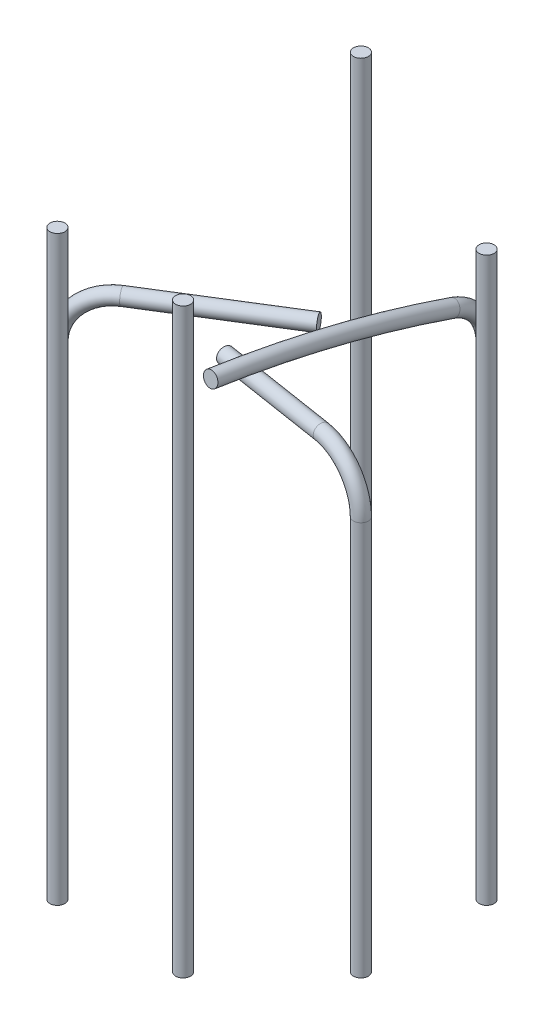
ISO-10303-21;
HEADER;
FILE_DESCRIPTION(('STEP AP214'),'2;1');
FILE_NAME('part.step','',(''),(''),'','','');
FILE_SCHEMA(('AUTOMOTIVE_DESIGN { 1 0 10303 214 1 1 1 1 }'));
ENDSEC;
DATA;
#1=APPLICATION_CONTEXT('core data for automotive mechanical design processes');
#2=APPLICATION_PROTOCOL_DEFINITION('international standard','automotive_design',2000,#1);
#3=PRODUCT_CONTEXT('',#1,'mechanical');
#4=PRODUCT('Part','Part','',(#3));
#5=PRODUCT_RELATED_PRODUCT_CATEGORY('part','',(#4));
#6=PRODUCT_DEFINITION_FORMATION('','',#4);
#7=PRODUCT_DEFINITION_CONTEXT('part definition',#1,'design');
#8=PRODUCT_DEFINITION('design','',#6,#7);
#9=PRODUCT_DEFINITION_SHAPE('','',#8);
#10=(LENGTH_UNIT() NAMED_UNIT(*) SI_UNIT(.MILLI.,.METRE.));
#11=(NAMED_UNIT(*) PLANE_ANGLE_UNIT() SI_UNIT($,.RADIAN.));
#12=(NAMED_UNIT(*) SI_UNIT($,.STERADIAN.) SOLID_ANGLE_UNIT());
#13=UNCERTAINTY_MEASURE_WITH_UNIT(LENGTH_MEASURE(1.E-05),#10,'distance_accuracy_value','');
#14=(GEOMETRIC_REPRESENTATION_CONTEXT(3) GLOBAL_UNCERTAINTY_ASSIGNED_CONTEXT((#13)) GLOBAL_UNIT_ASSIGNED_CONTEXT((#10,
#11,#12)) REPRESENTATION_CONTEXT('',''));
#15=CARTESIAN_POINT('',(0.,0.,0.));
#16=DIRECTION('',(0.,0.,1.));
#17=DIRECTION('',(1.,0.,0.));
#18=AXIS2_PLACEMENT_3D('',#15,#16,#17);
#19=CARTESIAN_POINT('',(2.41815802345188,-56.0965582466183,13.2239312862109));
#20=DIRECTION('',(0.999048221581857,0.,0.0436193873653495));
#21=DIRECTION('',(0.0436193873653495,0.,-0.999048221581857));
#22=AXIS2_PLACEMENT_3D('',#19,#20,#21);
#23=TOROIDAL_SURFACE('',#22,65.,0.4);
#24=CARTESIAN_POINT('',(3.27228250643434,5.88386232986473,-6.33873562118831));
#25=DIRECTION('',(-0.0415930457568139,0.301250830306413,0.952637368458937));
#26=DIRECTION('',(0.0304500014394865,-0.952637368458937,0.302580306080827));
#27=AXIS2_PLACEMENT_3D('',#24,#25,#26);
#28=CIRCLE('',#27,0.4);
#29=CARTESIAN_POINT('',(3.27753865709885,6.26528030264308,-6.45912126369538));
#30=VERTEX_POINT('',#29);
#31=EDGE_CURVE('E46',#30,#30,#28,.T.);
#32=CARTESIAN_POINT('',(2.73356167491425,8.49999999999999,6.));
#33=DIRECTION('',(-0.0433486507173479,0.111243283359509,0.992847332870659));
#34=DIRECTION('',(0.0387301258803981,-0.992847332870659,0.112934277174413));
#35=AXIS2_PLACEMENT_3D('',#32,#33,#34);
#36=CIRCLE('',#35,0.4);
#37=CARTESIAN_POINT('',(2.73550262046171,8.89751728151764,5.9555450382387));
#38=VERTEX_POINT('',#37);
#39=EDGE_CURVE('E11',#38,#38,#36,.T.);
#40=CARTESIAN_POINT('',(2.41815802345188,-56.0965582466183,13.2239312862109));
#41=DIRECTION('',(0.999048221581857,0.,0.0436193873653495));
#42=DIRECTION('',(0.0436193873653495,0.,-0.999048221581857));
#43=AXIS2_PLACEMENT_3D('',#40,#41,#42);
#44=CIRCLE('',#43,65.4);
#45=EDGE_CURVE('',#30,#38,#44,.T.);
#46=ORIENTED_EDGE('',*,*,#31,.T.);
#47=ORIENTED_EDGE('',*,*,#39,.F.);
#48=ORIENTED_EDGE('',*,*,#45,.T.);
#49=ORIENTED_EDGE('',*,*,#45,.F.);
#50=EDGE_LOOP('',(#46,#48,#47,#49));
#51=FACE_BOUND('',#50,.T.);
#52=ADVANCED_FACE('F40',(#51),#23,.T.);
#53=CARTESIAN_POINT('',(3.23943156478117,3.5,-5.58632535551912));
#54=DIRECTION('',(0.999048221581857,0.,0.0436193873653497));
#55=DIRECTION('',(0.0436193873653497,0.,-0.999048221581857));
#56=AXIS2_PLACEMENT_3D('',#53,#54,#55);
#57=TOROIDAL_SURFACE('',#56,2.5,0.4);
#58=CARTESIAN_POINT('',(3.34848003319454,3.5,-8.08394590947376));
#59=DIRECTION('',(0.,1.,0.));
#60=DIRECTION('',(0.,0.,1.));
#61=AXIS2_PLACEMENT_3D('',#58,#59,#60);
#62=CIRCLE('',#61,0.4);
#63=CARTESIAN_POINT('',(3.36592778814068,3.5,-8.4835651981065));
#64=VERTEX_POINT('',#63);
#65=EDGE_CURVE('E50',#64,#64,#62,.T.);
#66=CARTESIAN_POINT('',(3.23943156478117,3.5,-5.58632535551912));
#67=DIRECTION('',(0.999048221581857,0.,0.0436193873653497));
#68=DIRECTION('',(0.0436193873653497,0.,-0.999048221581857));
#69=AXIS2_PLACEMENT_3D('',#66,#67,#68);
#70=CIRCLE('',#69,2.9);
#71=EDGE_CURVE('',#64,#30,#70,.T.);
#72=ORIENTED_EDGE('',*,*,#65,.T.);
#73=ORIENTED_EDGE('',*,*,#31,.F.);
#74=ORIENTED_EDGE('',*,*,#71,.T.);
#75=ORIENTED_EDGE('',*,*,#71,.F.);
#76=EDGE_LOOP('',(#72,#74,#73,#75));
#77=FACE_BOUND('',#76,.T.);
#78=ADVANCED_FACE('F72',(#77),#57,.T.);
#79=CARTESIAN_POINT('',(3.34848003319454,3.5,-8.08394590947376));
#80=DIRECTION('',(0.,-1.,0.));
#81=DIRECTION('',(1.,0.,0.));
#82=AXIS2_PLACEMENT_3D('',#79,#80,#81);
#83=CYLINDRICAL_SURFACE('',#82,0.4);
#84=ORIENTED_EDGE('',*,*,#65,.F.);
#85=EDGE_LOOP('',(#84));
#86=FACE_BOUND('',#85,.T.);
#87=CARTESIAN_POINT('',(3.34848003319454,-17.5,-8.08394590947376));
#88=DIRECTION('',(0.,1.,0.));
#89=DIRECTION('',(0.,0.,1.));
#90=AXIS2_PLACEMENT_3D('',#87,#88,#89);
#91=CIRCLE('',#90,0.4);
#92=CARTESIAN_POINT('',(3.34848003319454,-17.5,-7.68394590947376));
#93=VERTEX_POINT('',#92);
#94=EDGE_CURVE('E54',#93,#93,#91,.T.);
#95=ORIENTED_EDGE('',*,*,#94,.T.);
#96=EDGE_LOOP('',(#95));
#97=FACE_BOUND('',#96,.T.);
#98=ADVANCED_FACE('F60',(#86,#97),#83,.T.);
#99=CARTESIAN_POINT('',(2.73356167491425,8.49999999999999,6.));
#100=DIRECTION('',(-0.0433486507173479,0.111243283359509,0.992847332870659));
#101=DIRECTION('',(0.0387301258803981,-0.992847332870659,0.112934277174413));
#102=AXIS2_PLACEMENT_3D('',#99,#100,#101);
#103=PLANE('',#102);
#104=ORIENTED_EDGE('',*,*,#39,.T.);
#105=EDGE_LOOP('',(#104));
#106=FACE_BOUND('',#105,.T.);
#107=ADVANCED_FACE('F64',(#106),#103,.T.);
#108=CARTESIAN_POINT('',(3.34848003319454,-17.5,-8.08394590947376));
#109=DIRECTION('',(0.,1.,0.));
#110=DIRECTION('',(0.,0.,1.));
#111=AXIS2_PLACEMENT_3D('',#108,#109,#110);
#112=PLANE('',#111);
#113=ORIENTED_EDGE('',*,*,#94,.F.);
#114=EDGE_LOOP('',(#113));
#115=FACE_BOUND('',#114,.T.);
#116=ADVANCED_FACE('F62',(#115),#112,.F.);
#117=CLOSED_SHELL('',(#52,#78,#98,#107,#116));
#118=MANIFOLD_SOLID_BREP('B2',#117);
#119=CARTESIAN_POINT('',(5.61423431360216,6.,2.9605049911913));
#120=DIRECTION('',(-0.987884638348633,0.,-0.155190016801311));
#121=DIRECTION('',(-0.155190016801311,0.,0.987884638348633));
#122=AXIS2_PLACEMENT_3D('',#119,#120,#121);
#123=CYLINDRICAL_SURFACE('',#122,0.400000000000001);
#124=CARTESIAN_POINT('',(5.61423431360216,6.,2.9605049911913));
#125=DIRECTION('',(-0.987884638348633,0.,-0.155190016801311));
#126=DIRECTION('',(-0.153309833623081,0.155190016801311,0.975916058685209));
#127=AXIS2_PLACEMENT_3D('',#124,#125,#126);
#128=CIRCLE('',#127,0.400000000000001);
#129=CARTESIAN_POINT('',(5.61423431360216,6.4,2.9605049911913));
#130=VERTEX_POINT('',#129);
#131=EDGE_CURVE('E125',#130,#130,#128,.T.);
#132=ORIENTED_EDGE('',*,*,#131,.T.);
#133=EDGE_LOOP('',(#132));
#134=FACE_BOUND('',#133,.T.);
#135=CARTESIAN_POINT('',(-0.500000000000001,6.,2.));
#136=DIRECTION('',(-0.987884638348633,0.,-0.155190016801311));
#137=DIRECTION('',(-0.153309833623081,0.155190016801311,0.975916058685209));
#138=AXIS2_PLACEMENT_3D('',#135,#136,#137);
#139=CIRCLE('',#138,0.400000000000001);
#140=CARTESIAN_POINT('',(-0.561323933449234,6.06207600672052,2.39036642347408));
#141=VERTEX_POINT('',#140);
#142=EDGE_CURVE('E39',#141,#141,#139,.T.);
#143=ORIENTED_EDGE('',*,*,#142,.F.);
#144=EDGE_LOOP('',(#143));
#145=FACE_BOUND('',#144,.T.);
#146=ADVANCED_FACE('F119',(#134,#145),#123,.T.);
#147=CARTESIAN_POINT('',(5.61423431360216,3.5,2.9605049911913));
#148=DIRECTION('',(-0.155190016801311,0.,0.987884638348633));
#149=DIRECTION('',(0.987884638348633,0.,0.155190016801311));
#150=AXIS2_PLACEMENT_3D('',#147,#148,#149);
#151=TOROIDAL_SURFACE('',#150,2.5,0.400000000000001);
#152=CARTESIAN_POINT('',(8.08394590947374,3.5,3.34848003319457));
#153=DIRECTION('',(0.,1.,0.));
#154=DIRECTION('',(0.,0.,1.));
#155=AXIS2_PLACEMENT_3D('',#152,#153,#154);
#156=CIRCLE('',#155,0.400000000000001);
#157=CARTESIAN_POINT('',(8.4790997648132,3.5,3.4105560399151));
#158=VERTEX_POINT('',#157);
#159=EDGE_CURVE('E129',#158,#158,#156,.T.);
#160=CARTESIAN_POINT('',(5.61423431360216,3.5,2.9605049911913));
#161=DIRECTION('',(-0.155190016801311,0.,0.987884638348633));
#162=DIRECTION('',(0.987884638348633,0.,0.155190016801311));
#163=AXIS2_PLACEMENT_3D('',#160,#161,#162);
#164=CIRCLE('',#163,2.9);
#165=EDGE_CURVE('',#158,#130,#164,.T.);
#166=ORIENTED_EDGE('',*,*,#159,.T.);
#167=ORIENTED_EDGE('',*,*,#131,.F.);
#168=ORIENTED_EDGE('',*,*,#165,.T.);
#169=ORIENTED_EDGE('',*,*,#165,.F.);
#170=EDGE_LOOP('',(#166,#168,#167,#169));
#171=FACE_BOUND('',#170,.T.);
#172=ADVANCED_FACE('F151',(#171),#151,.T.);
#173=CARTESIAN_POINT('',(8.08394590947374,3.5,3.34848003319457));
#174=DIRECTION('',(0.,-1.,0.));
#175=DIRECTION('',(0.,0.,-1.));
#176=AXIS2_PLACEMENT_3D('',#173,#174,#175);
#177=CYLINDRICAL_SURFACE('',#176,0.400000000000001);
#178=ORIENTED_EDGE('',*,*,#159,.F.);
#179=EDGE_LOOP('',(#178));
#180=FACE_BOUND('',#179,.T.);
#181=CARTESIAN_POINT('',(8.08394590947374,-17.5,3.34848003319457));
#182=DIRECTION('',(0.,1.,0.));
#183=DIRECTION('',(0.,0.,1.));
#184=AXIS2_PLACEMENT_3D('',#181,#182,#183);
#185=CIRCLE('',#184,0.400000000000001);
#186=CARTESIAN_POINT('',(8.08394590947374,-17.5,3.74848003319457));
#187=VERTEX_POINT('',#186);
#188=EDGE_CURVE('E133',#187,#187,#185,.T.);
#189=ORIENTED_EDGE('',*,*,#188,.T.);
#190=EDGE_LOOP('',(#189));
#191=FACE_BOUND('',#190,.T.);
#192=ADVANCED_FACE('F139',(#180,#191),#177,.T.);
#193=CARTESIAN_POINT('',(-0.500000000000001,6.,2.));
#194=DIRECTION('',(-0.987884638348633,0.,-0.155190016801311));
#195=DIRECTION('',(-0.153309833623081,0.155190016801311,0.975916058685209));
#196=AXIS2_PLACEMENT_3D('',#193,#194,#195);
#197=PLANE('',#196);
#198=ORIENTED_EDGE('',*,*,#142,.T.);
#199=EDGE_LOOP('',(#198));
#200=FACE_BOUND('',#199,.T.);
#201=ADVANCED_FACE('F143',(#200),#197,.T.);
#202=CARTESIAN_POINT('',(8.08394590947374,-17.5,3.34848003319457));
#203=DIRECTION('',(0.,1.,0.));
#204=DIRECTION('',(0.,0.,1.));
#205=AXIS2_PLACEMENT_3D('',#202,#203,#204);
#206=PLANE('',#205);
#207=ORIENTED_EDGE('',*,*,#188,.F.);
#208=EDGE_LOOP('',(#207));
#209=FACE_BOUND('',#208,.T.);
#210=ADVANCED_FACE('F141',(#209),#206,.F.);
#211=CLOSED_SHELL('',(#146,#172,#192,#201,#210));
#212=MANIFOLD_SOLID_BREP('B6',#211);
#213=CARTESIAN_POINT('',(-5.9621206527928,6.,2.02641438425316));
#214=DIRECTION('',(0.848730102672387,0.,-0.528826259576545));
#215=DIRECTION('',(-0.528826259576545,0.,-0.848730102672387));
#216=AXIS2_PLACEMENT_3D('',#213,#214,#215);
#217=CYLINDRICAL_SURFACE('',#216,0.4);
#218=CARTESIAN_POINT('',(-5.9621206527928,6.,2.02641438425316));
#219=DIRECTION('',(0.848730102672387,0.,-0.528826259576545));
#220=DIRECTION('',(0.448830765586256,0.528826259576544,0.720342787182281));
#221=AXIS2_PLACEMENT_3D('',#218,#219,#220);
#222=CIRCLE('',#221,0.4);
#223=CARTESIAN_POINT('',(-5.9621206527928,6.4,2.02641438425316));
#224=VERTEX_POINT('',#223);
#225=EDGE_CURVE('E204',#224,#224,#222,.T.);
#226=ORIENTED_EDGE('',*,*,#225,.T.);
#227=EDGE_LOOP('',(#226));
#228=FACE_BOUND('',#227,.T.);
#229=CARTESIAN_POINT('',(0.500000000000002,6.,-2.));
#230=DIRECTION('',(0.848730102672387,0.,-0.528826259576545));
#231=DIRECTION('',(0.448830765586256,0.528826259576544,0.720342787182281));
#232=AXIS2_PLACEMENT_3D('',#229,#230,#231);
#233=CIRCLE('',#232,0.4);
#234=CARTESIAN_POINT('',(0.679532306234505,6.21153050383062,-1.71186288512709));
#235=VERTEX_POINT('',#234);
#236=EDGE_CURVE('E118',#235,#235,#233,.T.);
#237=ORIENTED_EDGE('',*,*,#236,.F.);
#238=EDGE_LOOP('',(#237));
#239=FACE_BOUND('',#238,.T.);
#240=ADVANCED_FACE('F198',(#228,#239),#217,.T.);
#241=CARTESIAN_POINT('',(-5.9621206527928,3.5,2.02641438425316));
#242=DIRECTION('',(-0.528826259576545,0.,-0.848730102672387));
#243=DIRECTION('',(-0.848730102672387,0.,0.528826259576545));
#244=AXIS2_PLACEMENT_3D('',#241,#242,#243);
#245=TOROIDAL_SURFACE('',#244,2.5,0.4);
#246=CARTESIAN_POINT('',(-8.08394590947377,3.5,3.34848003319452));
#247=DIRECTION('',(0.,1.,0.));
#248=DIRECTION('',(0.,0.,1.));
#249=AXIS2_PLACEMENT_3D('',#246,#247,#248);
#250=CIRCLE('',#249,0.4);
#251=CARTESIAN_POINT('',(-8.42343795054272,3.5,3.56001053702513));
#252=VERTEX_POINT('',#251);
#253=EDGE_CURVE('E208',#252,#252,#250,.T.);
#254=CARTESIAN_POINT('',(-5.9621206527928,3.5,2.02641438425316));
#255=DIRECTION('',(-0.528826259576545,0.,-0.848730102672387));
#256=DIRECTION('',(-0.848730102672387,0.,0.528826259576545));
#257=AXIS2_PLACEMENT_3D('',#254,#255,#256);
#258=CIRCLE('',#257,2.9);
#259=EDGE_CURVE('',#252,#224,#258,.T.);
#260=ORIENTED_EDGE('',*,*,#253,.T.);
#261=ORIENTED_EDGE('',*,*,#225,.F.);
#262=ORIENTED_EDGE('',*,*,#259,.T.);
#263=ORIENTED_EDGE('',*,*,#259,.F.);
#264=EDGE_LOOP('',(#260,#262,#261,#263));
#265=FACE_BOUND('',#264,.T.);
#266=ADVANCED_FACE('F231',(#265),#245,.T.);
#267=CARTESIAN_POINT('',(-8.08394590947377,0.,3.34848003319452));
#268=DIRECTION('',(0.,-1.,0.));
#269=DIRECTION('',(0.,0.,-1.));
#270=AXIS2_PLACEMENT_3D('',#267,#268,#269);
#271=CYLINDRICAL_SURFACE('',#270,0.4);
#272=CARTESIAN_POINT('',(-8.08394590947377,-17.5,3.34848003319452));
#273=DIRECTION('',(0.,1.,0.));
#274=DIRECTION('',(0.,0.,1.));
#275=AXIS2_PLACEMENT_3D('',#272,#273,#274);
#276=CIRCLE('',#275,0.4);
#277=CARTESIAN_POINT('',(-8.08394590947377,-17.5,3.74848003319452));
#278=VERTEX_POINT('',#277);
#279=EDGE_CURVE('E212',#278,#278,#276,.T.);
#280=ORIENTED_EDGE('',*,*,#279,.T.);
#281=EDGE_LOOP('',(#280));
#282=FACE_BOUND('',#281,.T.);
#283=ORIENTED_EDGE('',*,*,#253,.F.);
#284=EDGE_LOOP('',(#283));
#285=FACE_BOUND('',#284,.T.);
#286=ADVANCED_FACE('F218',(#282,#285),#271,.T.);
#287=CARTESIAN_POINT('',(0.500000000000002,6.,-2.));
#288=DIRECTION('',(0.848730102672387,0.,-0.528826259576545));
#289=DIRECTION('',(0.448830765586256,0.528826259576544,0.720342787182281));
#290=AXIS2_PLACEMENT_3D('',#287,#288,#289);
#291=PLANE('',#290);
#292=ORIENTED_EDGE('',*,*,#236,.T.);
#293=EDGE_LOOP('',(#292));
#294=FACE_BOUND('',#293,.T.);
#295=ADVANCED_FACE('F223',(#294),#291,.T.);
#296=CARTESIAN_POINT('',(-8.08394590947377,-17.5,3.34848003319452));
#297=DIRECTION('',(0.,1.,0.));
#298=DIRECTION('',(0.,0.,1.));
#299=AXIS2_PLACEMENT_3D('',#296,#297,#298);
#300=PLANE('',#299);
#301=ORIENTED_EDGE('',*,*,#279,.F.);
#302=EDGE_LOOP('',(#301));
#303=FACE_BOUND('',#302,.T.);
#304=ADVANCED_FACE('F221',(#303),#300,.F.);
#305=CLOSED_SHELL('',(#240,#266,#286,#295,#304));
#306=MANIFOLD_SOLID_BREP('B34',#305);
#307=CARTESIAN_POINT('',(-3.34848003319454,-17.5,8.08394590947376));
#308=DIRECTION('',(0.,1.,0.));
#309=DIRECTION('',(0.,0.,1.));
#310=AXIS2_PLACEMENT_3D('',#307,#308,#309);
#311=CYLINDRICAL_SURFACE('',#310,0.4);
#312=CARTESIAN_POINT('',(-3.34848003319454,-17.5,8.08394590947376));
#313=DIRECTION('',(0.,1.,0.));
#314=DIRECTION('',(0.,0.,1.));
#315=AXIS2_PLACEMENT_3D('',#312,#313,#314);
#316=CIRCLE('',#315,0.4);
#317=CARTESIAN_POINT('',(-3.34848003319454,-17.5,8.48394590947376));
#318=VERTEX_POINT('',#317);
#319=EDGE_CURVE('E197',#318,#318,#316,.T.);
#320=ORIENTED_EDGE('',*,*,#319,.T.);
#321=EDGE_LOOP('',(#320));
#322=FACE_BOUND('',#321,.T.);
#323=CARTESIAN_POINT('',(-3.34848003319454,13.5,8.08394590947376));
#324=DIRECTION('',(0.,1.,0.));
#325=DIRECTION('',(0.,0.,1.));
#326=AXIS2_PLACEMENT_3D('',#323,#324,#325);
#327=CIRCLE('',#326,0.4);
#328=CARTESIAN_POINT('',(-3.34848003319454,13.5,8.48394590947376));
#329=VERTEX_POINT('',#328);
#330=EDGE_CURVE('E286',#329,#329,#327,.T.);
#331=ORIENTED_EDGE('',*,*,#330,.F.);
#332=EDGE_LOOP('',(#331));
#333=FACE_BOUND('',#332,.T.);
#334=ADVANCED_FACE('F280',(#322,#333),#311,.T.);
#335=CARTESIAN_POINT('',(-3.34848003319454,-17.5,8.08394590947376));
#336=DIRECTION('',(0.,1.,0.));
#337=DIRECTION('',(0.,0.,1.));
#338=AXIS2_PLACEMENT_3D('',#335,#336,#337);
#339=PLANE('',#338);
#340=ORIENTED_EDGE('',*,*,#319,.F.);
#341=EDGE_LOOP('',(#340));
#342=FACE_BOUND('',#341,.T.);
#343=ADVANCED_FACE('F295',(#342),#339,.F.);
#344=CARTESIAN_POINT('',(-3.34848003319454,13.5,8.08394590947376));
#345=DIRECTION('',(0.,1.,0.));
#346=DIRECTION('',(0.,0.,1.));
#347=AXIS2_PLACEMENT_3D('',#344,#345,#346);
#348=PLANE('',#347);
#349=ORIENTED_EDGE('',*,*,#330,.T.);
#350=EDGE_LOOP('',(#349));
#351=FACE_BOUND('',#350,.T.);
#352=ADVANCED_FACE('F292',(#351),#348,.T.);
#353=CLOSED_SHELL('',(#334,#343,#352));
#354=MANIFOLD_SOLID_BREP('B113',#353);
#355=CARTESIAN_POINT('',(-3.34848003319449,-17.5,-8.08394590947378));
#356=DIRECTION('',(0.,1.,0.));
#357=DIRECTION('',(0.,0.,1.));
#358=AXIS2_PLACEMENT_3D('',#355,#356,#357);
#359=CYLINDRICAL_SURFACE('',#358,0.4);
#360=CARTESIAN_POINT('',(-3.34848003319449,-17.5,-8.08394590947378));
#361=DIRECTION('',(0.,1.,0.));
#362=DIRECTION('',(0.,0.,1.));
#363=AXIS2_PLACEMENT_3D('',#360,#361,#362);
#364=CIRCLE('',#363,0.4);
#365=CARTESIAN_POINT('',(-3.34848003319449,-17.5,-7.68394590947378));
#366=VERTEX_POINT('',#365);
#367=EDGE_CURVE('E279',#366,#366,#364,.T.);
#368=ORIENTED_EDGE('',*,*,#367,.T.);
#369=EDGE_LOOP('',(#368));
#370=FACE_BOUND('',#369,.T.);
#371=CARTESIAN_POINT('',(-3.34848003319449,13.5,-8.08394590947378));
#372=DIRECTION('',(0.,1.,0.));
#373=DIRECTION('',(0.,0.,1.));
#374=AXIS2_PLACEMENT_3D('',#371,#372,#373);
#375=CIRCLE('',#374,0.4);
#376=CARTESIAN_POINT('',(-3.34848003319449,13.5,-7.68394590947378));
#377=VERTEX_POINT('',#376);
#378=EDGE_CURVE('E335',#377,#377,#375,.T.);
#379=ORIENTED_EDGE('',*,*,#378,.F.);
#380=EDGE_LOOP('',(#379));
#381=FACE_BOUND('',#380,.T.);
#382=ADVANCED_FACE('F329',(#370,#381),#359,.T.);
#383=CARTESIAN_POINT('',(-3.34848003319449,-17.5,-8.08394590947378));
#384=DIRECTION('',(0.,1.,0.));
#385=DIRECTION('',(0.,0.,1.));
#386=AXIS2_PLACEMENT_3D('',#383,#384,#385);
#387=PLANE('',#386);
#388=ORIENTED_EDGE('',*,*,#367,.F.);
#389=EDGE_LOOP('',(#388));
#390=FACE_BOUND('',#389,.T.);
#391=ADVANCED_FACE('F344',(#390),#387,.F.);
#392=CARTESIAN_POINT('',(-3.34848003319449,13.5,-8.08394590947378));
#393=DIRECTION('',(0.,1.,0.));
#394=DIRECTION('',(0.,0.,1.));
#395=AXIS2_PLACEMENT_3D('',#392,#393,#394);
#396=PLANE('',#395);
#397=ORIENTED_EDGE('',*,*,#378,.T.);
#398=EDGE_LOOP('',(#397));
#399=FACE_BOUND('',#398,.T.);
#400=ADVANCED_FACE('F341',(#399),#396,.T.);
#401=CLOSED_SHELL('',(#382,#391,#400));
#402=MANIFOLD_SOLID_BREP('B192',#401);
#403=CARTESIAN_POINT('',(8.08394590947377,-17.5,-3.34848003319452));
#404=DIRECTION('',(0.,1.,0.));
#405=DIRECTION('',(0.,0.,1.));
#406=AXIS2_PLACEMENT_3D('',#403,#404,#405);
#407=CYLINDRICAL_SURFACE('',#406,0.399999999999999);
#408=CARTESIAN_POINT('',(8.08394590947377,-17.5,-3.34848003319452));
#409=DIRECTION('',(0.,1.,0.));
#410=DIRECTION('',(0.,0.,1.));
#411=AXIS2_PLACEMENT_3D('',#408,#409,#410);
#412=CIRCLE('',#411,0.399999999999999);
#413=CARTESIAN_POINT('',(8.08394590947377,-17.5,-2.94848003319452));
#414=VERTEX_POINT('',#413);
#415=EDGE_CURVE('E328',#414,#414,#412,.T.);
#416=ORIENTED_EDGE('',*,*,#415,.T.);
#417=EDGE_LOOP('',(#416));
#418=FACE_BOUND('',#417,.T.);
#419=CARTESIAN_POINT('',(8.08394590947377,12.5,-3.34848003319452));
#420=DIRECTION('',(0.,1.,0.));
#421=DIRECTION('',(0.,0.,1.));
#422=AXIS2_PLACEMENT_3D('',#419,#420,#421);
#423=CIRCLE('',#422,0.399999999999999);
#424=CARTESIAN_POINT('',(8.08394590947377,12.5,-2.94848003319452));
#425=VERTEX_POINT('',#424);
#426=EDGE_CURVE('E383',#425,#425,#423,.T.);
#427=ORIENTED_EDGE('',*,*,#426,.F.);
#428=EDGE_LOOP('',(#427));
#429=FACE_BOUND('',#428,.T.);
#430=ADVANCED_FACE('F377',(#418,#429),#407,.T.);
#431=CARTESIAN_POINT('',(8.08394590947377,-17.5,-3.34848003319452));
#432=DIRECTION('',(0.,1.,0.));
#433=DIRECTION('',(0.,0.,1.));
#434=AXIS2_PLACEMENT_3D('',#431,#432,#433);
#435=PLANE('',#434);
#436=ORIENTED_EDGE('',*,*,#415,.F.);
#437=EDGE_LOOP('',(#436));
#438=FACE_BOUND('',#437,.T.);
#439=ADVANCED_FACE('F392',(#438),#435,.F.);
#440=CARTESIAN_POINT('',(8.08394590947377,12.5,-3.34848003319452));
#441=DIRECTION('',(0.,1.,0.));
#442=DIRECTION('',(0.,0.,1.));
#443=AXIS2_PLACEMENT_3D('',#440,#441,#442);
#444=PLANE('',#443);
#445=ORIENTED_EDGE('',*,*,#426,.T.);
#446=EDGE_LOOP('',(#445));
#447=FACE_BOUND('',#446,.T.);
#448=ADVANCED_FACE('F389',(#447),#444,.T.);
#449=CLOSED_SHELL('',(#430,#439,#448));
#450=MANIFOLD_SOLID_BREP('B274',#449);
#451=CARTESIAN_POINT('',(3.34848003319449,-17.5,8.08394590947378));
#452=DIRECTION('',(0.,1.,0.));
#453=DIRECTION('',(0.,0.,1.));
#454=AXIS2_PLACEMENT_3D('',#451,#452,#453);
#455=CYLINDRICAL_SURFACE('',#454,0.4);
#456=CARTESIAN_POINT('',(3.34848003319449,-17.5,8.08394590947378));
#457=DIRECTION('',(0.,1.,0.));
#458=DIRECTION('',(0.,0.,1.));
#459=AXIS2_PLACEMENT_3D('',#456,#457,#458);
#460=CIRCLE('',#459,0.4);
#461=CARTESIAN_POINT('',(3.34848003319449,-17.5,8.48394590947378));
#462=VERTEX_POINT('',#461);
#463=EDGE_CURVE('E376',#462,#462,#460,.T.);
#464=ORIENTED_EDGE('',*,*,#463,.T.);
#465=EDGE_LOOP('',(#464));
#466=FACE_BOUND('',#465,.T.);
#467=CARTESIAN_POINT('',(3.34848003319449,13.5,8.08394590947378));
#468=DIRECTION('',(0.,1.,0.));
#469=DIRECTION('',(0.,0.,1.));
#470=AXIS2_PLACEMENT_3D('',#467,#468,#469);
#471=CIRCLE('',#470,0.4);
#472=CARTESIAN_POINT('',(3.34848003319449,13.5,8.48394590947378));
#473=VERTEX_POINT('',#472);
#474=EDGE_CURVE('E424',#473,#473,#471,.T.);
#475=ORIENTED_EDGE('',*,*,#474,.F.);
#476=EDGE_LOOP('',(#475));
#477=FACE_BOUND('',#476,.T.);
#478=ADVANCED_FACE('F418',(#466,#477),#455,.T.);
#479=CARTESIAN_POINT('',(3.34848003319449,-17.5,8.08394590947378));
#480=DIRECTION('',(0.,1.,0.));
#481=DIRECTION('',(0.,0.,1.));
#482=AXIS2_PLACEMENT_3D('',#479,#480,#481);
#483=PLANE('',#482);
#484=ORIENTED_EDGE('',*,*,#463,.F.);
#485=EDGE_LOOP('',(#484));
#486=FACE_BOUND('',#485,.T.);
#487=ADVANCED_FACE('F433',(#486),#483,.F.);
#488=CARTESIAN_POINT('',(3.34848003319449,13.5,8.08394590947378));
#489=DIRECTION('',(0.,1.,0.));
#490=DIRECTION('',(0.,0.,1.));
#491=AXIS2_PLACEMENT_3D('',#488,#489,#490);
#492=PLANE('',#491);
#493=ORIENTED_EDGE('',*,*,#474,.T.);
#494=EDGE_LOOP('',(#493));
#495=FACE_BOUND('',#494,.T.);
#496=ADVANCED_FACE('F430',(#495),#492,.T.);
#497=CLOSED_SHELL('',(#478,#487,#496));
#498=MANIFOLD_SOLID_BREP('B323',#497);
#499=ADVANCED_BREP_SHAPE_REPRESENTATION('',(#18,#118,#212,#306,#354,#402,#450,#498),#14);
#500=SHAPE_DEFINITION_REPRESENTATION(#9,#499);
ENDSEC;
END-ISO-10303-21;
